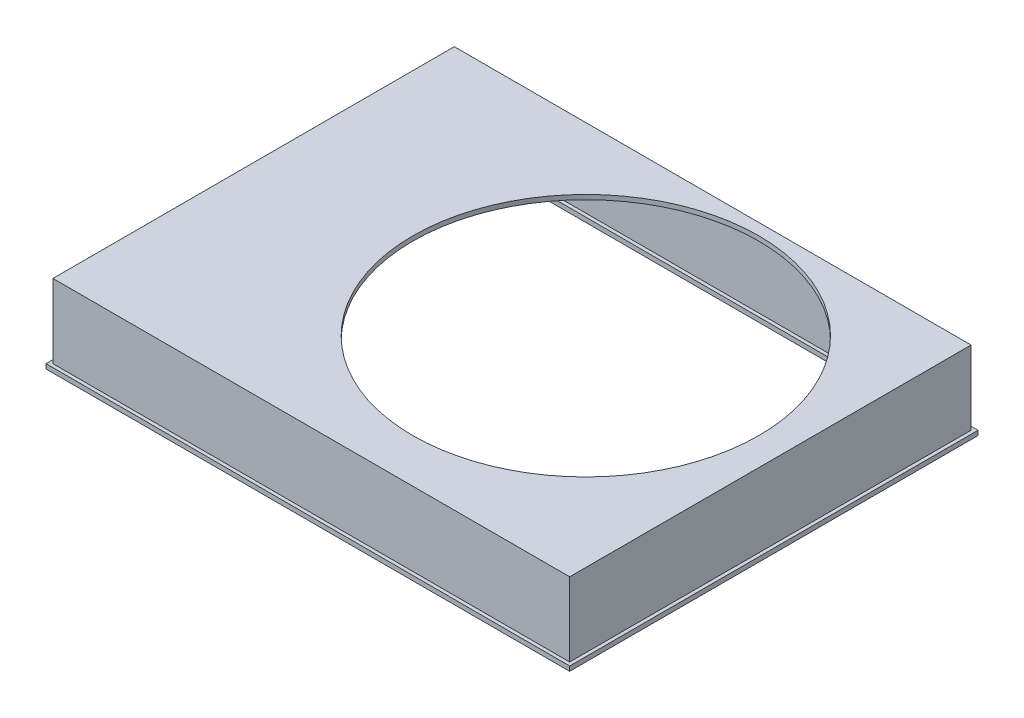
ISO-10303-21;
HEADER;
FILE_DESCRIPTION(('STEP AP214'),'2;1');
FILE_NAME('part.step','',(''),(''),'','','');
FILE_SCHEMA(('AUTOMOTIVE_DESIGN { 1 0 10303 214 1 1 1 1 }'));
ENDSEC;
DATA;
#1=APPLICATION_CONTEXT('core data for automotive mechanical design processes');
#2=APPLICATION_PROTOCOL_DEFINITION('international standard','automotive_design',2000,#1);
#3=PRODUCT_CONTEXT('',#1,'mechanical');
#4=PRODUCT('Part','Part','',(#3));
#5=PRODUCT_RELATED_PRODUCT_CATEGORY('part','',(#4));
#6=PRODUCT_DEFINITION_FORMATION('','',#4);
#7=PRODUCT_DEFINITION_CONTEXT('part definition',#1,'design');
#8=PRODUCT_DEFINITION('design','',#6,#7);
#9=PRODUCT_DEFINITION_SHAPE('','',#8);
#10=(LENGTH_UNIT() NAMED_UNIT(*) SI_UNIT(.MILLI.,.METRE.));
#11=(NAMED_UNIT(*) PLANE_ANGLE_UNIT() SI_UNIT($,.RADIAN.));
#12=(NAMED_UNIT(*) SI_UNIT($,.STERADIAN.) SOLID_ANGLE_UNIT());
#13=UNCERTAINTY_MEASURE_WITH_UNIT(LENGTH_MEASURE(1.E-05),#10,'distance_accuracy_value','');
#14=(GEOMETRIC_REPRESENTATION_CONTEXT(3) GLOBAL_UNCERTAINTY_ASSIGNED_CONTEXT((#13)) GLOBAL_UNIT_ASSIGNED_CONTEXT((#10,
#11,#12)) REPRESENTATION_CONTEXT('',''));
#15=CARTESIAN_POINT('',(0.,0.,0.));
#16=DIRECTION('',(0.,0.,1.));
#17=DIRECTION('',(1.,0.,0.));
#18=AXIS2_PLACEMENT_3D('',#15,#16,#17);
#19=CARTESIAN_POINT('',(0.,32.,0.));
#20=DIRECTION('',(1.,0.,0.));
#21=DIRECTION('',(0.,0.,-1.));
#22=AXIS2_PLACEMENT_3D('',#19,#20,#21);
#23=PLANE('',#22);
#24=DIRECTION('',(0.,-1.,0.));
#25=VECTOR('',#24,1.);
#26=CARTESIAN_POINT('',(0.,32.,0.));
#27=LINE('',#26,#25);
#28=CARTESIAN_POINT('',(0.,30.,0.));
#29=VERTEX_POINT('',#28);
#30=CARTESIAN_POINT('',(0.,0.,0.));
#31=VERTEX_POINT('',#30);
#32=EDGE_CURVE('E180',#29,#31,#27,.T.);
#33=ORIENTED_EDGE('',*,*,#32,.F.);
#34=DIRECTION('',(0.,0.,1.));
#35=VECTOR('',#34,1.);
#36=CARTESIAN_POINT('',(0.,30.,0.));
#37=LINE('',#36,#35);
#38=CARTESIAN_POINT('',(0.,30.,170.));
#39=VERTEX_POINT('',#38);
#40=EDGE_CURVE('E54',#29,#39,#37,.T.);
#41=ORIENTED_EDGE('',*,*,#40,.T.);
#42=DIRECTION('',(0.,-1.,0.));
#43=VECTOR('',#42,1.);
#44=CARTESIAN_POINT('',(0.,32.,170.));
#45=LINE('',#44,#43);
#46=CARTESIAN_POINT('',(0.,0.,170.));
#47=VERTEX_POINT('',#46);
#48=EDGE_CURVE('E123',#39,#47,#45,.T.);
#49=ORIENTED_EDGE('',*,*,#48,.T.);
#50=DIRECTION('',(0.,0.,1.));
#51=VECTOR('',#50,1.);
#52=CARTESIAN_POINT('',(0.,0.,0.));
#53=LINE('',#52,#51);
#54=EDGE_CURVE('E151',#31,#47,#53,.T.);
#55=ORIENTED_EDGE('',*,*,#54,.F.);
#56=EDGE_LOOP('',(#33,#41,#49,#55));
#57=FACE_BOUND('',#56,.T.);
#58=ADVANCED_FACE('F39',(#57),#23,.T.);
#59=CARTESIAN_POINT('',(0.,32.,170.));
#60=DIRECTION('',(0.,0.,-1.));
#61=DIRECTION('',(-1.,0.,0.));
#62=AXIS2_PLACEMENT_3D('',#59,#60,#61);
#63=PLANE('',#62);
#64=ORIENTED_EDGE('',*,*,#48,.F.);
#65=DIRECTION('',(1.,0.,0.));
#66=VECTOR('',#65,1.);
#67=CARTESIAN_POINT('',(-2.,30.,170.));
#68=LINE('',#67,#66);
#69=CARTESIAN_POINT('',(220.,30.,170.));
#70=VERTEX_POINT('',#69);
#71=EDGE_CURVE('E242',#39,#70,#68,.T.);
#72=ORIENTED_EDGE('',*,*,#71,.T.);
#73=DIRECTION('',(0.,-1.,0.));
#74=VECTOR('',#73,1.);
#75=CARTESIAN_POINT('',(220.,32.,170.));
#76=LINE('',#75,#74);
#77=CARTESIAN_POINT('',(220.,0.,170.));
#78=VERTEX_POINT('',#77);
#79=EDGE_CURVE('E156',#70,#78,#76,.T.);
#80=ORIENTED_EDGE('',*,*,#79,.T.);
#81=DIRECTION('',(1.,0.,0.));
#82=VECTOR('',#81,1.);
#83=CARTESIAN_POINT('',(0.,0.,170.));
#84=LINE('',#83,#82);
#85=EDGE_CURVE('E159',#47,#78,#84,.T.);
#86=ORIENTED_EDGE('',*,*,#85,.F.);
#87=EDGE_LOOP('',(#64,#72,#80,#86));
#88=FACE_BOUND('',#87,.T.);
#89=ADVANCED_FACE('F160',(#88),#63,.T.);
#90=CARTESIAN_POINT('',(220.,32.,0.));
#91=DIRECTION('',(-1.,0.,0.));
#92=DIRECTION('',(0.,0.,1.));
#93=AXIS2_PLACEMENT_3D('',#90,#91,#92);
#94=PLANE('',#93);
#95=ORIENTED_EDGE('',*,*,#79,.F.);
#96=DIRECTION('',(0.,0.,-1.));
#97=VECTOR('',#96,1.);
#98=CARTESIAN_POINT('',(220.,30.,-2.));
#99=LINE('',#98,#97);
#100=CARTESIAN_POINT('',(220.,30.,0.));
#101=VERTEX_POINT('',#100);
#102=EDGE_CURVE('E239',#70,#101,#99,.T.);
#103=ORIENTED_EDGE('',*,*,#102,.T.);
#104=DIRECTION('',(0.,-1.,0.));
#105=VECTOR('',#104,1.);
#106=CARTESIAN_POINT('',(220.,32.,0.));
#107=LINE('',#106,#105);
#108=CARTESIAN_POINT('',(220.,0.,0.));
#109=VERTEX_POINT('',#108);
#110=EDGE_CURVE('E85',#101,#109,#107,.T.);
#111=ORIENTED_EDGE('',*,*,#110,.T.);
#112=DIRECTION('',(0.,0.,-1.));
#113=VECTOR('',#112,1.);
#114=CARTESIAN_POINT('',(220.,0.,0.));
#115=LINE('',#114,#113);
#116=EDGE_CURVE('E164',#78,#109,#115,.T.);
#117=ORIENTED_EDGE('',*,*,#116,.F.);
#118=EDGE_LOOP('',(#95,#103,#111,#117));
#119=FACE_BOUND('',#118,.T.);
#120=ADVANCED_FACE('F246',(#119),#94,.T.);
#121=CARTESIAN_POINT('',(0.,32.,0.));
#122=DIRECTION('',(0.,0.,1.));
#123=DIRECTION('',(1.,0.,0.));
#124=AXIS2_PLACEMENT_3D('',#121,#122,#123);
#125=PLANE('',#124);
#126=ORIENTED_EDGE('',*,*,#110,.F.);
#127=DIRECTION('',(-1.,0.,0.));
#128=VECTOR('',#127,1.);
#129=CARTESIAN_POINT('',(0.,30.,0.));
#130=LINE('',#129,#128);
#131=EDGE_CURVE('E11',#101,#29,#130,.T.);
#132=ORIENTED_EDGE('',*,*,#131,.T.);
#133=ORIENTED_EDGE('',*,*,#32,.T.);
#134=DIRECTION('',(-1.,0.,0.));
#135=VECTOR('',#134,1.);
#136=CARTESIAN_POINT('',(0.,0.,0.));
#137=LINE('',#136,#135);
#138=EDGE_CURVE('E168',#109,#31,#137,.T.);
#139=ORIENTED_EDGE('',*,*,#138,.F.);
#140=EDGE_LOOP('',(#126,#132,#133,#139));
#141=FACE_BOUND('',#140,.T.);
#142=ADVANCED_FACE('F185',(#141),#125,.T.);
#143=CARTESIAN_POINT('',(0.,32.,0.));
#144=DIRECTION('',(0.,1.,0.));
#145=DIRECTION('',(0.,0.,1.));
#146=AXIS2_PLACEMENT_3D('',#143,#144,#145);
#147=PLANE('',#146);
#148=DIRECTION('',(-1.,0.,0.));
#149=VECTOR('',#148,1.);
#150=CARTESIAN_POINT('',(-2.,32.,-2.));
#151=LINE('',#150,#149);
#152=CARTESIAN_POINT('',(222.,32.,-2.));
#153=VERTEX_POINT('',#152);
#154=CARTESIAN_POINT('',(-2.,32.,-2.));
#155=VERTEX_POINT('',#154);
#156=EDGE_CURVE('E62',#153,#155,#151,.T.);
#157=ORIENTED_EDGE('',*,*,#156,.T.);
#158=DIRECTION('',(0.,0.,1.));
#159=VECTOR('',#158,1.);
#160=CARTESIAN_POINT('',(-2.,32.,-2.));
#161=LINE('',#160,#159);
#162=CARTESIAN_POINT('',(-2.,32.,172.));
#163=VERTEX_POINT('',#162);
#164=EDGE_CURVE('E101',#155,#163,#161,.T.);
#165=ORIENTED_EDGE('',*,*,#164,.T.);
#166=DIRECTION('',(1.,0.,0.));
#167=VECTOR('',#166,1.);
#168=CARTESIAN_POINT('',(-2.,32.,172.));
#169=LINE('',#168,#167);
#170=CARTESIAN_POINT('',(222.,32.,172.));
#171=VERTEX_POINT('',#170);
#172=EDGE_CURVE('E93',#163,#171,#169,.T.);
#173=ORIENTED_EDGE('',*,*,#172,.T.);
#174=DIRECTION('',(0.,0.,-1.));
#175=VECTOR('',#174,1.);
#176=CARTESIAN_POINT('',(222.,32.,-2.));
#177=LINE('',#176,#175);
#178=EDGE_CURVE('E98',#171,#153,#177,.T.);
#179=ORIENTED_EDGE('',*,*,#178,.T.);
#180=EDGE_LOOP('',(#157,#165,#173,#179));
#181=FACE_BOUND('',#180,.T.);
#182=CARTESIAN_POINT('',(135.,32.,78.));
#183=DIRECTION('',(0.,1.,0.));
#184=DIRECTION('',(0.,0.,1.));
#185=AXIS2_PLACEMENT_3D('',#182,#183,#184);
#186=CIRCLE('',#185,75.);
#187=CARTESIAN_POINT('',(135.,32.,153.));
#188=VERTEX_POINT('',#187);
#189=EDGE_CURVE('E469',#188,#188,#186,.T.);
#190=ORIENTED_EDGE('',*,*,#189,.F.);
#191=EDGE_LOOP('',(#190));
#192=FACE_BOUND('',#191,.T.);
#193=ADVANCED_FACE('F95',(#181,#192),#147,.T.);
#194=CARTESIAN_POINT('',(-2.,32.,-2.));
#195=DIRECTION('',(1.,0.,0.));
#196=DIRECTION('',(0.,0.,-1.));
#197=AXIS2_PLACEMENT_3D('',#194,#195,#196);
#198=PLANE('',#197);
#199=DIRECTION('',(0.,-1.,0.));
#200=VECTOR('',#199,1.);
#201=CARTESIAN_POINT('',(-2.,32.,172.));
#202=LINE('',#201,#200);
#203=CARTESIAN_POINT('',(-2.,0.,172.));
#204=VERTEX_POINT('',#203);
#205=EDGE_CURVE('E47',#163,#204,#202,.T.);
#206=ORIENTED_EDGE('',*,*,#205,.F.);
#207=ORIENTED_EDGE('',*,*,#164,.F.);
#208=DIRECTION('',(0.,-1.,0.));
#209=VECTOR('',#208,1.);
#210=CARTESIAN_POINT('',(-2.,32.,-2.));
#211=LINE('',#210,#209);
#212=CARTESIAN_POINT('',(-2.,0.,-2.));
#213=VERTEX_POINT('',#212);
#214=EDGE_CURVE('E116',#155,#213,#211,.T.);
#215=ORIENTED_EDGE('',*,*,#214,.T.);
#216=DIRECTION('',(0.,0.,1.));
#217=VECTOR('',#216,1.);
#218=CARTESIAN_POINT('',(-2.,0.,-2.));
#219=LINE('',#218,#217);
#220=EDGE_CURVE('E120',#213,#204,#219,.T.);
#221=ORIENTED_EDGE('',*,*,#220,.T.);
#222=EDGE_LOOP('',(#206,#207,#215,#221));
#223=FACE_BOUND('',#222,.T.);
#224=ADVANCED_FACE('F41',(#223),#198,.F.);
#225=CARTESIAN_POINT('',(-2.,32.,172.));
#226=DIRECTION('',(0.,0.,-1.));
#227=DIRECTION('',(-1.,0.,0.));
#228=AXIS2_PLACEMENT_3D('',#225,#226,#227);
#229=PLANE('',#228);
#230=DIRECTION('',(1.,0.,0.));
#231=VECTOR('',#230,1.);
#232=CARTESIAN_POINT('',(-2.,0.,172.));
#233=LINE('',#232,#231);
#234=CARTESIAN_POINT('',(222.,0.,172.));
#235=VERTEX_POINT('',#234);
#236=EDGE_CURVE('E109',#204,#235,#233,.T.);
#237=ORIENTED_EDGE('',*,*,#236,.T.);
#238=DIRECTION('',(0.,-1.,0.));
#239=VECTOR('',#238,1.);
#240=CARTESIAN_POINT('',(222.,32.,172.));
#241=LINE('',#240,#239);
#242=EDGE_CURVE('E107',#171,#235,#241,.T.);
#243=ORIENTED_EDGE('',*,*,#242,.F.);
#244=ORIENTED_EDGE('',*,*,#172,.F.);
#245=ORIENTED_EDGE('',*,*,#205,.T.);
#246=EDGE_LOOP('',(#237,#243,#244,#245));
#247=FACE_BOUND('',#246,.T.);
#248=ADVANCED_FACE('F108',(#247),#229,.F.);
#249=CARTESIAN_POINT('',(222.,32.,-2.));
#250=DIRECTION('',(-1.,0.,0.));
#251=DIRECTION('',(0.,0.,1.));
#252=AXIS2_PLACEMENT_3D('',#249,#250,#251);
#253=PLANE('',#252);
#254=DIRECTION('',(0.,0.,-1.));
#255=VECTOR('',#254,1.);
#256=CARTESIAN_POINT('',(222.,0.,-2.));
#257=LINE('',#256,#255);
#258=CARTESIAN_POINT('',(222.,0.,-2.));
#259=VERTEX_POINT('',#258);
#260=EDGE_CURVE('E75',#235,#259,#257,.T.);
#261=ORIENTED_EDGE('',*,*,#260,.T.);
#262=DIRECTION('',(0.,-1.,0.));
#263=VECTOR('',#262,1.);
#264=CARTESIAN_POINT('',(222.,32.,-2.));
#265=LINE('',#264,#263);
#266=EDGE_CURVE('E111',#153,#259,#265,.T.);
#267=ORIENTED_EDGE('',*,*,#266,.F.);
#268=ORIENTED_EDGE('',*,*,#178,.F.);
#269=ORIENTED_EDGE('',*,*,#242,.T.);
#270=EDGE_LOOP('',(#261,#267,#268,#269));
#271=FACE_BOUND('',#270,.T.);
#272=ADVANCED_FACE('F113',(#271),#253,.F.);
#273=CARTESIAN_POINT('',(-2.,32.,-2.));
#274=DIRECTION('',(0.,0.,1.));
#275=DIRECTION('',(1.,0.,0.));
#276=AXIS2_PLACEMENT_3D('',#273,#274,#275);
#277=PLANE('',#276);
#278=ORIENTED_EDGE('',*,*,#214,.F.);
#279=ORIENTED_EDGE('',*,*,#156,.F.);
#280=ORIENTED_EDGE('',*,*,#266,.T.);
#281=DIRECTION('',(-1.,0.,0.));
#282=VECTOR('',#281,1.);
#283=CARTESIAN_POINT('',(-2.,0.,-2.));
#284=LINE('',#283,#282);
#285=EDGE_CURVE('E126',#259,#213,#284,.T.);
#286=ORIENTED_EDGE('',*,*,#285,.T.);
#287=EDGE_LOOP('',(#278,#279,#280,#286));
#288=FACE_BOUND('',#287,.T.);
#289=ADVANCED_FACE('F141',(#288),#277,.F.);
#290=CARTESIAN_POINT('',(0.,0.,0.));
#291=DIRECTION('',(0.,1.,0.));
#292=DIRECTION('',(0.,0.,1.));
#293=AXIS2_PLACEMENT_3D('',#290,#291,#292);
#294=PLANE('',#293);
#295=DIRECTION('',(0.,0.,1.));
#296=VECTOR('',#295,1.);
#297=CARTESIAN_POINT('',(-3.5,0.,-3.5));
#298=LINE('',#297,#296);
#299=CARTESIAN_POINT('',(-3.5,0.,-3.5));
#300=VERTEX_POINT('',#299);
#301=CARTESIAN_POINT('',(-3.5,0.,173.5));
#302=VERTEX_POINT('',#301);
#303=EDGE_CURVE('E500',#300,#302,#298,.T.);
#304=ORIENTED_EDGE('',*,*,#303,.T.);
#305=DIRECTION('',(1.,0.,0.));
#306=VECTOR('',#305,1.);
#307=CARTESIAN_POINT('',(-3.5,0.,173.5));
#308=LINE('',#307,#306);
#309=CARTESIAN_POINT('',(223.5,0.,173.5));
#310=VERTEX_POINT('',#309);
#311=EDGE_CURVE('E522',#302,#310,#308,.T.);
#312=ORIENTED_EDGE('',*,*,#311,.T.);
#313=DIRECTION('',(0.,0.,-1.));
#314=VECTOR('',#313,1.);
#315=CARTESIAN_POINT('',(223.5,0.,-3.5));
#316=LINE('',#315,#314);
#317=CARTESIAN_POINT('',(223.5,0.,-3.5));
#318=VERTEX_POINT('',#317);
#319=EDGE_CURVE('E525',#310,#318,#316,.T.);
#320=ORIENTED_EDGE('',*,*,#319,.T.);
#321=DIRECTION('',(-1.,0.,0.));
#322=VECTOR('',#321,1.);
#323=CARTESIAN_POINT('',(-3.5,0.,-3.5));
#324=LINE('',#323,#322);
#325=EDGE_CURVE('E511',#318,#300,#324,.T.);
#326=ORIENTED_EDGE('',*,*,#325,.T.);
#327=EDGE_LOOP('',(#304,#312,#320,#326));
#328=FACE_BOUND('',#327,.T.);
#329=ORIENTED_EDGE('',*,*,#220,.F.);
#330=ORIENTED_EDGE('',*,*,#285,.F.);
#331=ORIENTED_EDGE('',*,*,#260,.F.);
#332=ORIENTED_EDGE('',*,*,#236,.F.);
#333=EDGE_LOOP('',(#329,#330,#331,#332));
#334=FACE_BOUND('',#333,.T.);
#335=ADVANCED_FACE('F138',(#328,#334),#294,.T.);
#336=CARTESIAN_POINT('',(-3.5,-2.,-3.5));
#337=DIRECTION('',(-1.,0.,0.));
#338=DIRECTION('',(0.,0.,1.));
#339=AXIS2_PLACEMENT_3D('',#336,#337,#338);
#340=PLANE('',#339);
#341=ORIENTED_EDGE('',*,*,#303,.F.);
#342=DIRECTION('',(0.,1.,0.));
#343=VECTOR('',#342,1.);
#344=CARTESIAN_POINT('',(-3.5,-2.,-3.5));
#345=LINE('',#344,#343);
#346=CARTESIAN_POINT('',(-3.5,-2.,-3.5));
#347=VERTEX_POINT('',#346);
#348=EDGE_CURVE('E169',#347,#300,#345,.T.);
#349=ORIENTED_EDGE('',*,*,#348,.F.);
#350=DIRECTION('',(0.,0.,1.));
#351=VECTOR('',#350,1.);
#352=CARTESIAN_POINT('',(-3.5,-2.,-3.5));
#353=LINE('',#352,#351);
#354=CARTESIAN_POINT('',(-3.5,-2.,173.5));
#355=VERTEX_POINT('',#354);
#356=EDGE_CURVE('E507',#347,#355,#353,.T.);
#357=ORIENTED_EDGE('',*,*,#356,.T.);
#358=DIRECTION('',(0.,1.,0.));
#359=VECTOR('',#358,1.);
#360=CARTESIAN_POINT('',(-3.5,-2.,173.5));
#361=LINE('',#360,#359);
#362=EDGE_CURVE('E175',#355,#302,#361,.T.);
#363=ORIENTED_EDGE('',*,*,#362,.T.);
#364=EDGE_LOOP('',(#341,#349,#357,#363));
#365=FACE_BOUND('',#364,.T.);
#366=ADVANCED_FACE('F392',(#365),#340,.T.);
#367=CARTESIAN_POINT('',(-3.5,-2.,-3.5));
#368=DIRECTION('',(0.,0.,-1.));
#369=DIRECTION('',(-1.,0.,0.));
#370=AXIS2_PLACEMENT_3D('',#367,#368,#369);
#371=PLANE('',#370);
#372=ORIENTED_EDGE('',*,*,#325,.F.);
#373=DIRECTION('',(0.,1.,0.));
#374=VECTOR('',#373,1.);
#375=CARTESIAN_POINT('',(223.5,-2.,-3.5));
#376=LINE('',#375,#374);
#377=CARTESIAN_POINT('',(223.5,-2.,-3.5));
#378=VERTEX_POINT('',#377);
#379=EDGE_CURVE('E172',#378,#318,#376,.T.);
#380=ORIENTED_EDGE('',*,*,#379,.F.);
#381=DIRECTION('',(-1.,0.,0.));
#382=VECTOR('',#381,1.);
#383=CARTESIAN_POINT('',(-3.5,-2.,-3.5));
#384=LINE('',#383,#382);
#385=EDGE_CURVE('E517',#378,#347,#384,.T.);
#386=ORIENTED_EDGE('',*,*,#385,.T.);
#387=ORIENTED_EDGE('',*,*,#348,.T.);
#388=EDGE_LOOP('',(#372,#380,#386,#387));
#389=FACE_BOUND('',#388,.T.);
#390=ADVANCED_FACE('F381',(#389),#371,.T.);
#391=CARTESIAN_POINT('',(223.5,-2.,-3.5));
#392=DIRECTION('',(1.,0.,0.));
#393=DIRECTION('',(0.,0.,-1.));
#394=AXIS2_PLACEMENT_3D('',#391,#392,#393);
#395=PLANE('',#394);
#396=ORIENTED_EDGE('',*,*,#319,.F.);
#397=DIRECTION('',(0.,1.,0.));
#398=VECTOR('',#397,1.);
#399=CARTESIAN_POINT('',(223.5,-2.,173.5));
#400=LINE('',#399,#398);
#401=CARTESIAN_POINT('',(223.5,-2.,173.5));
#402=VERTEX_POINT('',#401);
#403=EDGE_CURVE('E530',#402,#310,#400,.T.);
#404=ORIENTED_EDGE('',*,*,#403,.F.);
#405=DIRECTION('',(0.,0.,-1.));
#406=VECTOR('',#405,1.);
#407=CARTESIAN_POINT('',(223.5,-2.,-3.5));
#408=LINE('',#407,#406);
#409=EDGE_CURVE('E514',#402,#378,#408,.T.);
#410=ORIENTED_EDGE('',*,*,#409,.T.);
#411=ORIENTED_EDGE('',*,*,#379,.T.);
#412=EDGE_LOOP('',(#396,#404,#410,#411));
#413=FACE_BOUND('',#412,.T.);
#414=ADVANCED_FACE('F370',(#413),#395,.T.);
#415=CARTESIAN_POINT('',(-3.5,-2.,173.5));
#416=DIRECTION('',(0.,0.,1.));
#417=DIRECTION('',(1.,0.,0.));
#418=AXIS2_PLACEMENT_3D('',#415,#416,#417);
#419=PLANE('',#418);
#420=ORIENTED_EDGE('',*,*,#311,.F.);
#421=ORIENTED_EDGE('',*,*,#362,.F.);
#422=DIRECTION('',(1.,0.,0.));
#423=VECTOR('',#422,1.);
#424=CARTESIAN_POINT('',(-3.5,-2.,173.5));
#425=LINE('',#424,#423);
#426=EDGE_CURVE('E510',#355,#402,#425,.T.);
#427=ORIENTED_EDGE('',*,*,#426,.T.);
#428=ORIENTED_EDGE('',*,*,#403,.T.);
#429=EDGE_LOOP('',(#420,#421,#427,#428));
#430=FACE_BOUND('',#429,.T.);
#431=ADVANCED_FACE('F359',(#430),#419,.T.);
#432=CARTESIAN_POINT('',(0.,-2.,0.));
#433=DIRECTION('',(0.,1.,0.));
#434=DIRECTION('',(0.,0.,1.));
#435=AXIS2_PLACEMENT_3D('',#432,#433,#434);
#436=PLANE('',#435);
#437=DIRECTION('',(1.,0.,0.));
#438=VECTOR('',#437,1.);
#439=CARTESIAN_POINT('',(218.5,-2.,168.5));
#440=LINE('',#439,#438);
#441=CARTESIAN_POINT('',(1.5,-2.,168.5));
#442=VERTEX_POINT('',#441);
#443=CARTESIAN_POINT('',(218.5,-2.,168.5));
#444=VERTEX_POINT('',#443);
#445=EDGE_CURVE('E485',#442,#444,#440,.T.);
#446=ORIENTED_EDGE('',*,*,#445,.T.);
#447=DIRECTION('',(0.,0.,-1.));
#448=VECTOR('',#447,1.);
#449=CARTESIAN_POINT('',(218.5,-2.,168.5));
#450=LINE('',#449,#448);
#451=CARTESIAN_POINT('',(218.5,-2.,1.5));
#452=VERTEX_POINT('',#451);
#453=EDGE_CURVE('E475',#444,#452,#450,.T.);
#454=ORIENTED_EDGE('',*,*,#453,.T.);
#455=DIRECTION('',(-1.,0.,0.));
#456=VECTOR('',#455,1.);
#457=CARTESIAN_POINT('',(218.5,-2.,1.5));
#458=LINE('',#457,#456);
#459=CARTESIAN_POINT('',(1.5,-2.,1.5));
#460=VERTEX_POINT('',#459);
#461=EDGE_CURVE('E478',#452,#460,#458,.T.);
#462=ORIENTED_EDGE('',*,*,#461,.T.);
#463=DIRECTION('',(0.,0.,1.));
#464=VECTOR('',#463,1.);
#465=CARTESIAN_POINT('',(1.5,-2.,168.5));
#466=LINE('',#465,#464);
#467=EDGE_CURVE('E482',#460,#442,#466,.T.);
#468=ORIENTED_EDGE('',*,*,#467,.T.);
#469=EDGE_LOOP('',(#446,#454,#462,#468));
#470=FACE_BOUND('',#469,.T.);
#471=ORIENTED_EDGE('',*,*,#356,.F.);
#472=ORIENTED_EDGE('',*,*,#385,.F.);
#473=ORIENTED_EDGE('',*,*,#409,.F.);
#474=ORIENTED_EDGE('',*,*,#426,.F.);
#475=EDGE_LOOP('',(#471,#472,#473,#474));
#476=FACE_BOUND('',#475,.T.);
#477=ADVANCED_FACE('F349',(#470,#476),#436,.F.);
#478=ORIENTED_EDGE('',*,*,#138,.T.);
#479=ORIENTED_EDGE('',*,*,#54,.T.);
#480=ORIENTED_EDGE('',*,*,#85,.T.);
#481=ORIENTED_EDGE('',*,*,#116,.T.);
#482=EDGE_LOOP('',(#478,#479,#480,#481));
#483=FACE_BOUND('',#482,.T.);
#484=DIRECTION('',(0.,0.,-1.));
#485=VECTOR('',#484,1.);
#486=CARTESIAN_POINT('',(218.5,0.,168.5));
#487=LINE('',#486,#485);
#488=CARTESIAN_POINT('',(218.5,0.,168.5));
#489=VERTEX_POINT('',#488);
#490=CARTESIAN_POINT('',(218.5,0.,1.5));
#491=VERTEX_POINT('',#490);
#492=EDGE_CURVE('E474',#489,#491,#487,.T.);
#493=ORIENTED_EDGE('',*,*,#492,.F.);
#494=DIRECTION('',(1.,0.,0.));
#495=VECTOR('',#494,1.);
#496=CARTESIAN_POINT('',(218.5,0.,168.5));
#497=LINE('',#496,#495);
#498=CARTESIAN_POINT('',(1.5,0.,168.5));
#499=VERTEX_POINT('',#498);
#500=EDGE_CURVE('E479',#499,#489,#497,.T.);
#501=ORIENTED_EDGE('',*,*,#500,.F.);
#502=DIRECTION('',(0.,0.,1.));
#503=VECTOR('',#502,1.);
#504=CARTESIAN_POINT('',(1.5,0.,168.5));
#505=LINE('',#504,#503);
#506=CARTESIAN_POINT('',(1.5,0.,1.5));
#507=VERTEX_POINT('',#506);
#508=EDGE_CURVE('E493',#507,#499,#505,.T.);
#509=ORIENTED_EDGE('',*,*,#508,.F.);
#510=DIRECTION('',(-1.,0.,0.));
#511=VECTOR('',#510,1.);
#512=CARTESIAN_POINT('',(218.5,0.,1.5));
#513=LINE('',#512,#511);
#514=EDGE_CURVE('E490',#491,#507,#513,.T.);
#515=ORIENTED_EDGE('',*,*,#514,.F.);
#516=EDGE_LOOP('',(#493,#501,#509,#515));
#517=FACE_BOUND('',#516,.T.);
#518=ADVANCED_FACE('F166',(#483,#517),#294,.T.);
#519=CARTESIAN_POINT('',(218.5,-2.,168.5));
#520=DIRECTION('',(1.,0.,0.));
#521=DIRECTION('',(0.,0.,-1.));
#522=AXIS2_PLACEMENT_3D('',#519,#520,#521);
#523=PLANE('',#522);
#524=ORIENTED_EDGE('',*,*,#492,.T.);
#525=DIRECTION('',(0.,1.,0.));
#526=VECTOR('',#525,1.);
#527=CARTESIAN_POINT('',(218.5,-2.,1.5));
#528=LINE('',#527,#526);
#529=EDGE_CURVE('E488',#452,#491,#528,.T.);
#530=ORIENTED_EDGE('',*,*,#529,.F.);
#531=ORIENTED_EDGE('',*,*,#453,.F.);
#532=DIRECTION('',(0.,1.,0.));
#533=VECTOR('',#532,1.);
#534=CARTESIAN_POINT('',(218.5,-2.,168.5));
#535=LINE('',#534,#533);
#536=EDGE_CURVE('E498',#444,#489,#535,.T.);
#537=ORIENTED_EDGE('',*,*,#536,.T.);
#538=EDGE_LOOP('',(#524,#530,#531,#537));
#539=FACE_BOUND('',#538,.T.);
#540=ADVANCED_FACE('F328',(#539),#523,.F.);
#541=CARTESIAN_POINT('',(218.5,-2.,168.5));
#542=DIRECTION('',(0.,0.,1.));
#543=DIRECTION('',(1.,0.,0.));
#544=AXIS2_PLACEMENT_3D('',#541,#542,#543);
#545=PLANE('',#544);
#546=ORIENTED_EDGE('',*,*,#500,.T.);
#547=ORIENTED_EDGE('',*,*,#536,.F.);
#548=ORIENTED_EDGE('',*,*,#445,.F.);
#549=DIRECTION('',(0.,1.,0.));
#550=VECTOR('',#549,1.);
#551=CARTESIAN_POINT('',(1.5,-2.,168.5));
#552=LINE('',#551,#550);
#553=EDGE_CURVE('E501',#442,#499,#552,.T.);
#554=ORIENTED_EDGE('',*,*,#553,.T.);
#555=EDGE_LOOP('',(#546,#547,#548,#554));
#556=FACE_BOUND('',#555,.T.);
#557=ADVANCED_FACE('F317',(#556),#545,.F.);
#558=CARTESIAN_POINT('',(1.5,-2.,168.5));
#559=DIRECTION('',(-1.,0.,0.));
#560=DIRECTION('',(0.,0.,1.));
#561=AXIS2_PLACEMENT_3D('',#558,#559,#560);
#562=PLANE('',#561);
#563=ORIENTED_EDGE('',*,*,#508,.T.);
#564=ORIENTED_EDGE('',*,*,#553,.F.);
#565=ORIENTED_EDGE('',*,*,#467,.F.);
#566=DIRECTION('',(0.,1.,0.));
#567=VECTOR('',#566,1.);
#568=CARTESIAN_POINT('',(1.5,-2.,1.5));
#569=LINE('',#568,#567);
#570=EDGE_CURVE('E503',#460,#507,#569,.T.);
#571=ORIENTED_EDGE('',*,*,#570,.T.);
#572=EDGE_LOOP('',(#563,#564,#565,#571));
#573=FACE_BOUND('',#572,.T.);
#574=ADVANCED_FACE('F306',(#573),#562,.F.);
#575=CARTESIAN_POINT('',(218.5,-2.,1.5));
#576=DIRECTION('',(0.,0.,-1.));
#577=DIRECTION('',(-1.,0.,0.));
#578=AXIS2_PLACEMENT_3D('',#575,#576,#577);
#579=PLANE('',#578);
#580=ORIENTED_EDGE('',*,*,#514,.T.);
#581=ORIENTED_EDGE('',*,*,#570,.F.);
#582=ORIENTED_EDGE('',*,*,#461,.F.);
#583=ORIENTED_EDGE('',*,*,#529,.T.);
#584=EDGE_LOOP('',(#580,#581,#582,#583));
#585=FACE_BOUND('',#584,.T.);
#586=ADVANCED_FACE('F301',(#585),#579,.F.);
#587=CARTESIAN_POINT('',(0.,30.,0.));
#588=DIRECTION('',(0.,1.,0.));
#589=DIRECTION('',(0.,0.,1.));
#590=AXIS2_PLACEMENT_3D('',#587,#588,#589);
#591=PLANE('',#590);
#592=ORIENTED_EDGE('',*,*,#40,.F.);
#593=ORIENTED_EDGE('',*,*,#131,.F.);
#594=ORIENTED_EDGE('',*,*,#102,.F.);
#595=ORIENTED_EDGE('',*,*,#71,.F.);
#596=EDGE_LOOP('',(#592,#593,#594,#595));
#597=FACE_BOUND('',#596,.T.);
#598=CARTESIAN_POINT('',(135.,30.,78.));
#599=DIRECTION('',(0.,1.,0.));
#600=DIRECTION('',(0.,0.,1.));
#601=AXIS2_PLACEMENT_3D('',#598,#599,#600);
#602=CIRCLE('',#601,75.);
#603=CARTESIAN_POINT('',(135.,30.,153.));
#604=VERTEX_POINT('',#603);
#605=EDGE_CURVE('E244',#604,#604,#602,.T.);
#606=ORIENTED_EDGE('',*,*,#605,.T.);
#607=EDGE_LOOP('',(#606));
#608=FACE_BOUND('',#607,.T.);
#609=ADVANCED_FACE('F240',(#597,#608),#591,.F.);
#610=CARTESIAN_POINT('',(135.,30.,78.));
#611=DIRECTION('',(0.,1.,0.));
#612=DIRECTION('',(0.,0.,1.));
#613=AXIS2_PLACEMENT_3D('',#610,#611,#612);
#614=CYLINDRICAL_SURFACE('',#613,75.);
#615=ORIENTED_EDGE('',*,*,#605,.F.);
#616=EDGE_LOOP('',(#615));
#617=FACE_BOUND('',#616,.T.);
#618=ORIENTED_EDGE('',*,*,#189,.T.);
#619=EDGE_LOOP('',(#618));
#620=FACE_BOUND('',#619,.T.);
#621=ADVANCED_FACE('F449',(#617,#620),#614,.F.);
#622=CLOSED_SHELL('',(#58,#89,#120,#142,#193,#224,#248,#272,#289,#335,#366,#390,#414,#431,#477,
#518,#540,#557,#574,#586,#609,#621));
#623=MANIFOLD_SOLID_BREP('B2',#622);
#624=ADVANCED_BREP_SHAPE_REPRESENTATION('',(#18,#623),#14);
#625=SHAPE_DEFINITION_REPRESENTATION(#9,#624);
ENDSEC;
END-ISO-10303-21;
